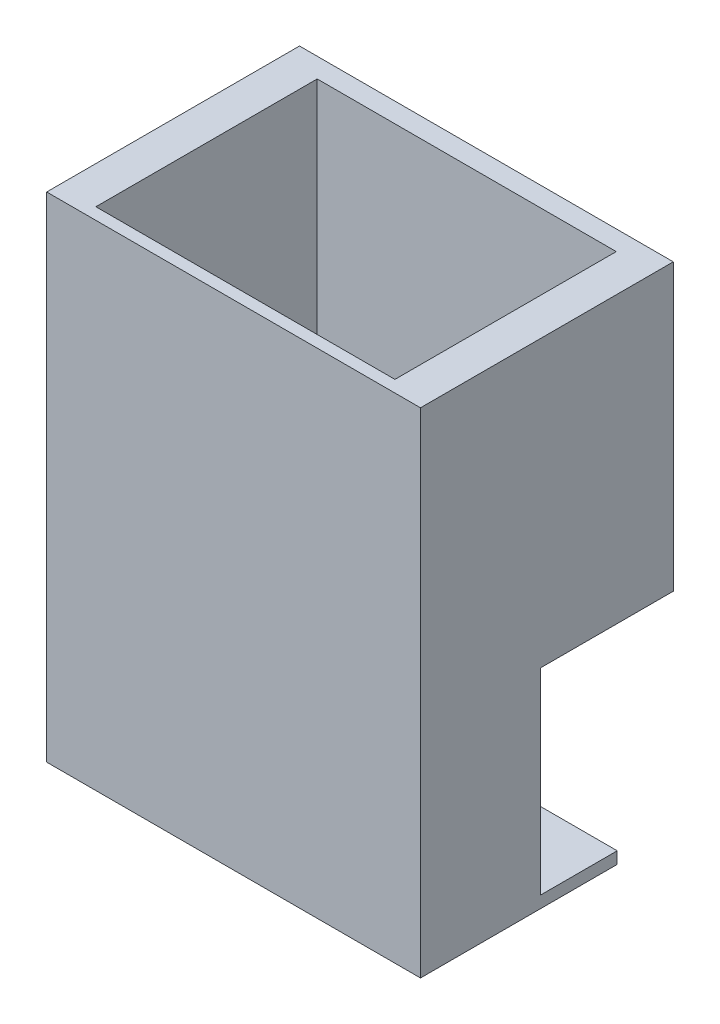
ISO-10303-21;
HEADER;
FILE_DESCRIPTION(('STEP AP214'),'2;1');
FILE_NAME('part.step','',(''),(''),'','','');
FILE_SCHEMA(('AUTOMOTIVE_DESIGN { 1 0 10303 214 1 1 1 1 }'));
ENDSEC;
DATA;
#1=APPLICATION_CONTEXT('core data for automotive mechanical design processes');
#2=APPLICATION_PROTOCOL_DEFINITION('international standard','automotive_design',2000,#1);
#3=PRODUCT_CONTEXT('',#1,'mechanical');
#4=PRODUCT('Part','Part','',(#3));
#5=PRODUCT_RELATED_PRODUCT_CATEGORY('part','',(#4));
#6=PRODUCT_DEFINITION_FORMATION('','',#4);
#7=PRODUCT_DEFINITION_CONTEXT('part definition',#1,'design');
#8=PRODUCT_DEFINITION('design','',#6,#7);
#9=PRODUCT_DEFINITION_SHAPE('','',#8);
#10=(LENGTH_UNIT() NAMED_UNIT(*) SI_UNIT(.MILLI.,.METRE.));
#11=(NAMED_UNIT(*) PLANE_ANGLE_UNIT() SI_UNIT($,.RADIAN.));
#12=(NAMED_UNIT(*) SI_UNIT($,.STERADIAN.) SOLID_ANGLE_UNIT());
#13=UNCERTAINTY_MEASURE_WITH_UNIT(LENGTH_MEASURE(1.E-05),#10,'distance_accuracy_value','');
#14=(GEOMETRIC_REPRESENTATION_CONTEXT(3) GLOBAL_UNCERTAINTY_ASSIGNED_CONTEXT((#13)) GLOBAL_UNIT_ASSIGNED_CONTEXT((#10,
#11,#12)) REPRESENTATION_CONTEXT('',''));
#15=CARTESIAN_POINT('',(0.,0.,0.));
#16=DIRECTION('',(0.,0.,1.));
#17=DIRECTION('',(1.,0.,0.));
#18=AXIS2_PLACEMENT_3D('',#15,#16,#17);
#19=CARTESIAN_POINT('',(0.,38.354,0.));
#20=DIRECTION('',(0.,-1.,0.));
#21=DIRECTION('',(0.,0.,-1.));
#22=AXIS2_PLACEMENT_3D('',#19,#20,#21);
#23=PLANE('',#22);
#24=DIRECTION('',(-1.,0.,0.));
#25=VECTOR('',#24,1.);
#26=CARTESIAN_POINT('',(43.434,38.354,-12.319));
#27=LINE('',#26,#25);
#28=CARTESIAN_POINT('',(43.434,38.354,-12.319));
#29=VERTEX_POINT('',#28);
#30=CARTESIAN_POINT('',(40.259,38.354,-12.319));
#31=VERTEX_POINT('',#30);
#32=EDGE_CURVE('E305',#29,#31,#27,.T.);
#33=ORIENTED_EDGE('',*,*,#32,.F.);
#34=DIRECTION('',(0.,0.,-1.));
#35=VECTOR('',#34,1.);
#36=CARTESIAN_POINT('',(43.434,38.354,-1.52399999999999));
#37=LINE('',#36,#35);
#38=CARTESIAN_POINT('',(43.434,38.354,-15.494));
#39=VERTEX_POINT('',#38);
#40=EDGE_CURVE('E11',#29,#39,#37,.T.);
#41=ORIENTED_EDGE('',*,*,#40,.T.);
#42=DIRECTION('',(-1.,0.,0.));
#43=VECTOR('',#42,1.);
#44=CARTESIAN_POINT('',(43.434,38.354,-15.494));
#45=LINE('',#44,#43);
#46=CARTESIAN_POINT('',(40.259,38.354,-15.494));
#47=VERTEX_POINT('',#46);
#48=EDGE_CURVE('E333',#39,#47,#45,.T.);
#49=ORIENTED_EDGE('',*,*,#48,.T.);
#50=DIRECTION('',(0.,0.,-1.));
#51=VECTOR('',#50,1.);
#52=CARTESIAN_POINT('',(40.259,38.354,-15.494));
#53=LINE('',#52,#51);
#54=EDGE_CURVE('E297',#31,#47,#53,.T.);
#55=ORIENTED_EDGE('',*,*,#54,.F.);
#56=EDGE_LOOP('',(#33,#41,#49,#55));
#57=FACE_BOUND('',#56,.T.);
#58=ADVANCED_FACE('F43',(#57),#23,.F.);
#59=CARTESIAN_POINT('',(0.,38.354,-15.494));
#60=DIRECTION('',(0.,0.,1.));
#61=DIRECTION('',(1.,0.,0.));
#62=AXIS2_PLACEMENT_3D('',#59,#60,#61);
#63=PLANE('',#62);
#64=DIRECTION('',(0.,-1.,0.));
#65=VECTOR('',#64,1.);
#66=CARTESIAN_POINT('',(4.826,38.354,-15.494));
#67=LINE('',#66,#65);
#68=CARTESIAN_POINT('',(4.826,38.354,-15.494));
#69=VERTEX_POINT('',#68);
#70=CARTESIAN_POINT('',(4.826,26.924,-15.494));
#71=VERTEX_POINT('',#70);
#72=EDGE_CURVE('E266',#69,#71,#67,.T.);
#73=ORIENTED_EDGE('',*,*,#72,.F.);
#74=DIRECTION('',(-1.,0.,0.));
#75=VECTOR('',#74,1.);
#76=CARTESIAN_POINT('',(0.,38.354,-15.494));
#77=LINE('',#76,#75);
#78=CARTESIAN_POINT('',(8.001,38.354,-15.494));
#79=VERTEX_POINT('',#78);
#80=EDGE_CURVE('E336',#79,#69,#77,.T.);
#81=ORIENTED_EDGE('',*,*,#80,.F.);
#82=DIRECTION('',(0.109679122404642,-0.993967046792069,0.));
#83=VECTOR('',#82,1.);
#84=CARTESIAN_POINT('',(8.001,38.354,-15.494));
#85=LINE('',#84,#83);
#86=CARTESIAN_POINT('',(12.065,1.524,-15.494));
#87=VERTEX_POINT('',#86);
#88=EDGE_CURVE('E288',#79,#87,#85,.T.);
#89=ORIENTED_EDGE('',*,*,#88,.T.);
#90=DIRECTION('',(-1.,0.,0.));
#91=VECTOR('',#90,1.);
#92=CARTESIAN_POINT('',(0.,1.524,-15.494));
#93=LINE('',#92,#91);
#94=CARTESIAN_POINT('',(0.,1.524,-15.494));
#95=VERTEX_POINT('',#94);
#96=EDGE_CURVE('E67',#87,#95,#93,.T.);
#97=ORIENTED_EDGE('',*,*,#96,.T.);
#98=DIRECTION('',(0.,-1.,0.));
#99=VECTOR('',#98,1.);
#100=CARTESIAN_POINT('',(0.,38.354,-15.494));
#101=LINE('',#100,#99);
#102=CARTESIAN_POINT('',(0.,26.924,-15.494));
#103=VERTEX_POINT('',#102);
#104=EDGE_CURVE('E340',#103,#95,#101,.T.);
#105=ORIENTED_EDGE('',*,*,#104,.F.);
#106=DIRECTION('',(-1.,0.,0.));
#107=VECTOR('',#106,1.);
#108=CARTESIAN_POINT('',(0.,26.924,-15.494));
#109=LINE('',#108,#107);
#110=EDGE_CURVE('E263',#71,#103,#109,.T.);
#111=ORIENTED_EDGE('',*,*,#110,.F.);
#112=EDGE_LOOP('',(#73,#81,#89,#97,#105,#111));
#113=FACE_BOUND('',#112,.T.);
#114=ADVANCED_FACE('F430',(#113),#63,.F.);
#115=CARTESIAN_POINT('',(43.434,38.354,-15.494));
#116=DIRECTION('',(0.,0.,1.));
#117=DIRECTION('',(1.,0.,0.));
#118=AXIS2_PLACEMENT_3D('',#115,#116,#117);
#119=PLANE('',#118);
#120=DIRECTION('',(-1.,0.,0.));
#121=VECTOR('',#120,1.);
#122=CARTESIAN_POINT('',(48.26,26.924,-15.494));
#123=LINE('',#122,#121);
#124=CARTESIAN_POINT('',(48.26,26.924,-15.494));
#125=VERTEX_POINT('',#124);
#126=CARTESIAN_POINT('',(43.434,26.924,-15.494));
#127=VERTEX_POINT('',#126);
#128=EDGE_CURVE('E269',#125,#127,#123,.T.);
#129=ORIENTED_EDGE('',*,*,#128,.F.);
#130=DIRECTION('',(0.,-1.,0.));
#131=VECTOR('',#130,1.);
#132=CARTESIAN_POINT('',(48.26,38.354,-15.494));
#133=LINE('',#132,#131);
#134=CARTESIAN_POINT('',(48.26,1.524,-15.494));
#135=VERTEX_POINT('',#134);
#136=EDGE_CURVE('E364',#125,#135,#133,.T.);
#137=ORIENTED_EDGE('',*,*,#136,.T.);
#138=DIRECTION('',(-1.,0.,0.));
#139=VECTOR('',#138,1.);
#140=CARTESIAN_POINT('',(43.434,1.524,-15.494));
#141=LINE('',#140,#139);
#142=CARTESIAN_POINT('',(36.195,1.524,-15.494));
#143=VERTEX_POINT('',#142);
#144=EDGE_CURVE('E328',#135,#143,#141,.T.);
#145=ORIENTED_EDGE('',*,*,#144,.T.);
#146=DIRECTION('',(0.109679122404642,0.993967046792069,0.));
#147=VECTOR('',#146,1.);
#148=CARTESIAN_POINT('',(40.259,38.354,-15.494));
#149=LINE('',#148,#147);
#150=EDGE_CURVE('E292',#143,#47,#149,.T.);
#151=ORIENTED_EDGE('',*,*,#150,.T.);
#152=ORIENTED_EDGE('',*,*,#48,.F.);
#153=DIRECTION('',(0.,1.,0.));
#154=VECTOR('',#153,1.);
#155=CARTESIAN_POINT('',(43.434,38.354,-15.494));
#156=LINE('',#155,#154);
#157=EDGE_CURVE('E198',#127,#39,#156,.T.);
#158=ORIENTED_EDGE('',*,*,#157,.F.);
#159=EDGE_LOOP('',(#129,#137,#145,#151,#152,#158));
#160=FACE_BOUND('',#159,.T.);
#161=ADVANCED_FACE('F456',(#160),#119,.F.);
#162=CARTESIAN_POINT('',(0.,1.524,0.));
#163=DIRECTION('',(0.,-1.,0.));
#164=DIRECTION('',(0.,0.,-1.));
#165=AXIS2_PLACEMENT_3D('',#162,#163,#164);
#166=PLANE('',#165);
#167=ORIENTED_EDGE('',*,*,#96,.F.);
#168=DIRECTION('',(0.,0.,-1.));
#169=VECTOR('',#168,1.);
#170=CARTESIAN_POINT('',(12.065,1.524,24.7345422868044));
#171=LINE('',#170,#169);
#172=CARTESIAN_POINT('',(12.065,1.524,-12.319));
#173=VERTEX_POINT('',#172);
#174=EDGE_CURVE('E285',#173,#87,#171,.T.);
#175=ORIENTED_EDGE('',*,*,#174,.F.);
#176=DIRECTION('',(1.,0.,0.));
#177=VECTOR('',#176,1.);
#178=CARTESIAN_POINT('',(4.826,1.524,-12.319));
#179=LINE('',#178,#177);
#180=CARTESIAN_POINT('',(4.826,1.524,-12.319));
#181=VERTEX_POINT('',#180);
#182=EDGE_CURVE('E315',#181,#173,#179,.T.);
#183=ORIENTED_EDGE('',*,*,#182,.F.);
#184=DIRECTION('',(0.,0.,-1.));
#185=VECTOR('',#184,1.);
#186=CARTESIAN_POINT('',(4.826,1.524,-15.494));
#187=LINE('',#186,#185);
#188=CARTESIAN_POINT('',(4.826,1.524,-1.52399999999999));
#189=VERTEX_POINT('',#188);
#190=EDGE_CURVE('E350',#189,#181,#187,.T.);
#191=ORIENTED_EDGE('',*,*,#190,.F.);
#192=DIRECTION('',(-1.,0.,0.));
#193=VECTOR('',#192,1.);
#194=CARTESIAN_POINT('',(4.826,1.524,-1.52399999999999));
#195=LINE('',#194,#193);
#196=CARTESIAN_POINT('',(43.434,1.524,-1.52399999999999));
#197=VERTEX_POINT('',#196);
#198=EDGE_CURVE('E346',#197,#189,#195,.T.);
#199=ORIENTED_EDGE('',*,*,#198,.F.);
#200=DIRECTION('',(0.,0.,1.));
#201=VECTOR('',#200,1.);
#202=CARTESIAN_POINT('',(43.434,1.524,-1.52399999999999));
#203=LINE('',#202,#201);
#204=CARTESIAN_POINT('',(43.434,1.524,-12.319));
#205=VERTEX_POINT('',#204);
#206=EDGE_CURVE('E343',#205,#197,#203,.T.);
#207=ORIENTED_EDGE('',*,*,#206,.F.);
#208=DIRECTION('',(1.,0.,0.));
#209=VECTOR('',#208,1.);
#210=CARTESIAN_POINT('',(43.434,1.524,-12.319));
#211=LINE('',#210,#209);
#212=CARTESIAN_POINT('',(36.195,1.524,-12.319));
#213=VERTEX_POINT('',#212);
#214=EDGE_CURVE('E312',#213,#205,#211,.T.);
#215=ORIENTED_EDGE('',*,*,#214,.F.);
#216=DIRECTION('',(0.,0.,-1.));
#217=VECTOR('',#216,1.);
#218=CARTESIAN_POINT('',(36.195,1.524,24.7345422868044));
#219=LINE('',#218,#217);
#220=EDGE_CURVE('E298',#213,#143,#219,.T.);
#221=ORIENTED_EDGE('',*,*,#220,.T.);
#222=ORIENTED_EDGE('',*,*,#144,.F.);
#223=DIRECTION('',(0.,0.,-1.));
#224=VECTOR('',#223,1.);
#225=CARTESIAN_POINT('',(48.26,1.524,0.));
#226=LINE('',#225,#224);
#227=CARTESIAN_POINT('',(48.26,1.524,-25.4));
#228=VERTEX_POINT('',#227);
#229=EDGE_CURVE('E376',#135,#228,#226,.T.);
#230=ORIENTED_EDGE('',*,*,#229,.T.);
#231=DIRECTION('',(1.,0.,0.));
#232=VECTOR('',#231,1.);
#233=CARTESIAN_POINT('',(0.,1.524,-25.4));
#234=LINE('',#233,#232);
#235=CARTESIAN_POINT('',(0.,1.524,-25.4));
#236=VERTEX_POINT('',#235);
#237=EDGE_CURVE('E371',#236,#228,#234,.T.);
#238=ORIENTED_EDGE('',*,*,#237,.F.);
#239=DIRECTION('',(0.,0.,-1.));
#240=VECTOR('',#239,1.);
#241=CARTESIAN_POINT('',(0.,1.524,0.));
#242=LINE('',#241,#240);
#243=EDGE_CURVE('E368',#95,#236,#242,.T.);
#244=ORIENTED_EDGE('',*,*,#243,.F.);
#245=EDGE_LOOP('',(#167,#175,#183,#191,#199,#207,#215,#221,#222,#230,#238,#244));
#246=FACE_BOUND('',#245,.T.);
#247=ADVANCED_FACE('F437',(#246),#166,.F.);
#248=CARTESIAN_POINT('',(43.434,38.354,-1.52399999999999));
#249=DIRECTION('',(1.,0.,0.));
#250=DIRECTION('',(0.,0.,-1.));
#251=AXIS2_PLACEMENT_3D('',#248,#249,#250);
#252=PLANE('',#251);
#253=DIRECTION('',(0.,-1.,0.));
#254=VECTOR('',#253,1.);
#255=CARTESIAN_POINT('',(43.434,42.8441280605346,-12.319));
#256=LINE('',#255,#254);
#257=EDGE_CURVE('E309',#29,#205,#256,.T.);
#258=ORIENTED_EDGE('',*,*,#257,.T.);
#259=ORIENTED_EDGE('',*,*,#206,.T.);
#260=DIRECTION('',(0.,-1.,0.));
#261=VECTOR('',#260,1.);
#262=CARTESIAN_POINT('',(43.434,38.354,-1.52399999999999));
#263=LINE('',#262,#261);
#264=CARTESIAN_POINT('',(43.434,63.754,-1.52399999999999));
#265=VERTEX_POINT('',#264);
#266=EDGE_CURVE('E205',#265,#197,#263,.T.);
#267=ORIENTED_EDGE('',*,*,#266,.F.);
#268=DIRECTION('',(0.,0.,-1.));
#269=VECTOR('',#268,1.);
#270=CARTESIAN_POINT('',(43.434,63.754,-1.52399999999999));
#271=LINE('',#270,#269);
#272=CARTESIAN_POINT('',(43.434,63.754,-30.099));
#273=VERTEX_POINT('',#272);
#274=EDGE_CURVE('E201',#265,#273,#271,.T.);
#275=ORIENTED_EDGE('',*,*,#274,.T.);
#276=DIRECTION('',(0.,1.,0.));
#277=VECTOR('',#276,1.);
#278=CARTESIAN_POINT('',(43.434,38.354,-30.099));
#279=LINE('',#278,#277);
#280=CARTESIAN_POINT('',(43.434,26.924,-30.099));
#281=VERTEX_POINT('',#280);
#282=EDGE_CURVE('E185',#281,#273,#279,.T.);
#283=ORIENTED_EDGE('',*,*,#282,.F.);
#284=DIRECTION('',(0.,0.,1.));
#285=VECTOR('',#284,1.);
#286=CARTESIAN_POINT('',(43.434,26.924,-30.099));
#287=LINE('',#286,#285);
#288=EDGE_CURVE('E197',#281,#127,#287,.T.);
#289=ORIENTED_EDGE('',*,*,#288,.T.);
#290=ORIENTED_EDGE('',*,*,#157,.T.);
#291=ORIENTED_EDGE('',*,*,#40,.F.);
#292=EDGE_LOOP('',(#258,#259,#267,#275,#283,#289,#290,#291));
#293=FACE_BOUND('',#292,.T.);
#294=ADVANCED_FACE('F203',(#293),#252,.F.);
#295=CARTESIAN_POINT('',(4.826,38.354,-15.494));
#296=DIRECTION('',(-1.,0.,0.));
#297=DIRECTION('',(0.,0.,1.));
#298=AXIS2_PLACEMENT_3D('',#295,#296,#297);
#299=PLANE('',#298);
#300=DIRECTION('',(0.,-1.,0.));
#301=VECTOR('',#300,1.);
#302=CARTESIAN_POINT('',(4.826,42.8441280605346,-12.319));
#303=LINE('',#302,#301);
#304=CARTESIAN_POINT('',(4.826,38.354,-12.319));
#305=VERTEX_POINT('',#304);
#306=EDGE_CURVE('E324',#305,#181,#303,.T.);
#307=ORIENTED_EDGE('',*,*,#306,.F.);
#308=DIRECTION('',(0.,0.,1.));
#309=VECTOR('',#308,1.);
#310=CARTESIAN_POINT('',(4.826,38.354,-1.52399999999999));
#311=LINE('',#310,#309);
#312=EDGE_CURVE('E53',#69,#305,#311,.T.);
#313=ORIENTED_EDGE('',*,*,#312,.F.);
#314=ORIENTED_EDGE('',*,*,#72,.T.);
#315=DIRECTION('',(0.,0.,1.));
#316=VECTOR('',#315,1.);
#317=CARTESIAN_POINT('',(4.826,26.924,-30.099));
#318=LINE('',#317,#316);
#319=CARTESIAN_POINT('',(4.826,26.924,-30.099));
#320=VERTEX_POINT('',#319);
#321=EDGE_CURVE('E254',#320,#71,#318,.T.);
#322=ORIENTED_EDGE('',*,*,#321,.F.);
#323=DIRECTION('',(0.,-1.,0.));
#324=VECTOR('',#323,1.);
#325=CARTESIAN_POINT('',(4.826,38.354,-30.099));
#326=LINE('',#325,#324);
#327=CARTESIAN_POINT('',(4.826,63.754,-30.099));
#328=VERTEX_POINT('',#327);
#329=EDGE_CURVE('E262',#328,#320,#326,.T.);
#330=ORIENTED_EDGE('',*,*,#329,.F.);
#331=DIRECTION('',(0.,0.,1.));
#332=VECTOR('',#331,1.);
#333=CARTESIAN_POINT('',(4.826,63.754,-1.52399999999999));
#334=LINE('',#333,#332);
#335=CARTESIAN_POINT('',(4.826,63.754,-1.52399999999999));
#336=VERTEX_POINT('',#335);
#337=EDGE_CURVE('E213',#328,#336,#334,.T.);
#338=ORIENTED_EDGE('',*,*,#337,.T.);
#339=DIRECTION('',(0.,-1.,0.));
#340=VECTOR('',#339,1.);
#341=CARTESIAN_POINT('',(4.826,38.354,-1.52399999999999));
#342=LINE('',#341,#340);
#343=EDGE_CURVE('E358',#336,#189,#342,.T.);
#344=ORIENTED_EDGE('',*,*,#343,.T.);
#345=ORIENTED_EDGE('',*,*,#190,.T.);
#346=EDGE_LOOP('',(#307,#313,#314,#322,#330,#338,#344,#345));
#347=FACE_BOUND('',#346,.T.);
#348=ADVANCED_FACE('F441',(#347),#299,.F.);
#349=CARTESIAN_POINT('',(0.,1.524,0.));
#350=DIRECTION('',(-1.,0.,0.));
#351=DIRECTION('',(0.,0.,1.));
#352=AXIS2_PLACEMENT_3D('',#349,#350,#351);
#353=PLANE('',#352);
#354=DIRECTION('',(0.,0.,-1.));
#355=VECTOR('',#354,1.);
#356=CARTESIAN_POINT('',(0.,0.,0.));
#357=LINE('',#356,#355);
#358=CARTESIAN_POINT('',(0.,0.,0.));
#359=VERTEX_POINT('',#358);
#360=CARTESIAN_POINT('',(0.,0.,-25.4));
#361=VERTEX_POINT('',#360);
#362=EDGE_CURVE('E367',#359,#361,#357,.T.);
#363=ORIENTED_EDGE('',*,*,#362,.F.);
#364=DIRECTION('',(0.,-1.,0.));
#365=VECTOR('',#364,1.);
#366=CARTESIAN_POINT('',(0.,1.524,0.));
#367=LINE('',#366,#365);
#368=CARTESIAN_POINT('',(0.,63.754,0.));
#369=VERTEX_POINT('',#368);
#370=EDGE_CURVE('E226',#369,#359,#367,.T.);
#371=ORIENTED_EDGE('',*,*,#370,.F.);
#372=DIRECTION('',(0.,0.,1.));
#373=VECTOR('',#372,1.);
#374=CARTESIAN_POINT('',(0.,63.754,-32.639));
#375=LINE('',#374,#373);
#376=CARTESIAN_POINT('',(0.,63.754,-32.639));
#377=VERTEX_POINT('',#376);
#378=EDGE_CURVE('E221',#377,#369,#375,.T.);
#379=ORIENTED_EDGE('',*,*,#378,.F.);
#380=DIRECTION('',(0.,1.,0.));
#381=VECTOR('',#380,1.);
#382=CARTESIAN_POINT('',(0.,38.354,-32.639));
#383=LINE('',#382,#381);
#384=CARTESIAN_POINT('',(0.,26.924,-32.639));
#385=VERTEX_POINT('',#384);
#386=EDGE_CURVE('E246',#385,#377,#383,.T.);
#387=ORIENTED_EDGE('',*,*,#386,.F.);
#388=DIRECTION('',(0.,0.,1.));
#389=VECTOR('',#388,1.);
#390=CARTESIAN_POINT('',(0.,26.924,-30.099));
#391=LINE('',#390,#389);
#392=EDGE_CURVE('E258',#385,#103,#391,.T.);
#393=ORIENTED_EDGE('',*,*,#392,.T.);
#394=ORIENTED_EDGE('',*,*,#104,.T.);
#395=ORIENTED_EDGE('',*,*,#243,.T.);
#396=DIRECTION('',(0.,-1.,0.));
#397=VECTOR('',#396,1.);
#398=CARTESIAN_POINT('',(0.,1.524,-25.4));
#399=LINE('',#398,#397);
#400=EDGE_CURVE('E47',#236,#361,#399,.T.);
#401=ORIENTED_EDGE('',*,*,#400,.T.);
#402=EDGE_LOOP('',(#363,#371,#379,#387,#393,#394,#395,#401));
#403=FACE_BOUND('',#402,.T.);
#404=ADVANCED_FACE('F45',(#403),#353,.T.);
#405=CARTESIAN_POINT('',(0.,1.524,0.));
#406=DIRECTION('',(0.,0.,-1.));
#407=DIRECTION('',(-1.,0.,0.));
#408=AXIS2_PLACEMENT_3D('',#405,#406,#407);
#409=PLANE('',#408);
#410=DIRECTION('',(1.,0.,0.));
#411=VECTOR('',#410,1.);
#412=CARTESIAN_POINT('',(0.,0.,0.));
#413=LINE('',#412,#411);
#414=CARTESIAN_POINT('',(48.26,0.,0.));
#415=VERTEX_POINT('',#414);
#416=EDGE_CURVE('E372',#359,#415,#413,.T.);
#417=ORIENTED_EDGE('',*,*,#416,.T.);
#418=DIRECTION('',(0.,-1.,0.));
#419=VECTOR('',#418,1.);
#420=CARTESIAN_POINT('',(48.26,1.524,0.));
#421=LINE('',#420,#419);
#422=CARTESIAN_POINT('',(48.26,63.754,0.));
#423=VERTEX_POINT('',#422);
#424=EDGE_CURVE('E394',#423,#415,#421,.T.);
#425=ORIENTED_EDGE('',*,*,#424,.F.);
#426=DIRECTION('',(1.,0.,0.));
#427=VECTOR('',#426,1.);
#428=CARTESIAN_POINT('',(0.,63.754,0.));
#429=LINE('',#428,#427);
#430=EDGE_CURVE('E230',#369,#423,#429,.T.);
#431=ORIENTED_EDGE('',*,*,#430,.F.);
#432=ORIENTED_EDGE('',*,*,#370,.T.);
#433=EDGE_LOOP('',(#417,#425,#431,#432));
#434=FACE_BOUND('',#433,.T.);
#435=ADVANCED_FACE('F413',(#434),#409,.F.);
#436=CARTESIAN_POINT('',(48.26,1.524,0.));
#437=DIRECTION('',(-1.,0.,0.));
#438=DIRECTION('',(0.,0.,1.));
#439=AXIS2_PLACEMENT_3D('',#436,#437,#438);
#440=PLANE('',#439);
#441=DIRECTION('',(0.,0.,-1.));
#442=VECTOR('',#441,1.);
#443=CARTESIAN_POINT('',(48.26,0.,0.));
#444=LINE('',#443,#442);
#445=CARTESIAN_POINT('',(48.26,0.,-25.4));
#446=VERTEX_POINT('',#445);
#447=EDGE_CURVE('E386',#415,#446,#444,.T.);
#448=ORIENTED_EDGE('',*,*,#447,.T.);
#449=DIRECTION('',(0.,-1.,0.));
#450=VECTOR('',#449,1.);
#451=CARTESIAN_POINT('',(48.26,1.524,-25.4));
#452=LINE('',#451,#450);
#453=EDGE_CURVE('E397',#228,#446,#452,.T.);
#454=ORIENTED_EDGE('',*,*,#453,.F.);
#455=ORIENTED_EDGE('',*,*,#229,.F.);
#456=ORIENTED_EDGE('',*,*,#136,.F.);
#457=DIRECTION('',(0.,0.,1.));
#458=VECTOR('',#457,1.);
#459=CARTESIAN_POINT('',(48.26,26.924,-30.099));
#460=LINE('',#459,#458);
#461=CARTESIAN_POINT('',(48.26,26.924,-32.639));
#462=VERTEX_POINT('',#461);
#463=EDGE_CURVE('E278',#462,#125,#460,.T.);
#464=ORIENTED_EDGE('',*,*,#463,.F.);
#465=DIRECTION('',(0.,1.,0.));
#466=VECTOR('',#465,1.);
#467=CARTESIAN_POINT('',(48.26,38.354,-32.639));
#468=LINE('',#467,#466);
#469=CARTESIAN_POINT('',(48.26,63.754,-32.639));
#470=VERTEX_POINT('',#469);
#471=EDGE_CURVE('E242',#462,#470,#468,.T.);
#472=ORIENTED_EDGE('',*,*,#471,.T.);
#473=DIRECTION('',(0.,0.,-1.));
#474=VECTOR('',#473,1.);
#475=CARTESIAN_POINT('',(48.26,63.754,-32.639));
#476=LINE('',#475,#474);
#477=EDGE_CURVE('E234',#423,#470,#476,.T.);
#478=ORIENTED_EDGE('',*,*,#477,.F.);
#479=ORIENTED_EDGE('',*,*,#424,.T.);
#480=EDGE_LOOP('',(#448,#454,#455,#456,#464,#472,#478,#479));
#481=FACE_BOUND('',#480,.T.);
#482=ADVANCED_FACE('F417',(#481),#440,.F.);
#483=CARTESIAN_POINT('',(0.,1.524,-25.4));
#484=DIRECTION('',(0.,0.,-1.));
#485=DIRECTION('',(-1.,0.,0.));
#486=AXIS2_PLACEMENT_3D('',#483,#484,#485);
#487=PLANE('',#486);
#488=DIRECTION('',(1.,0.,0.));
#489=VECTOR('',#488,1.);
#490=CARTESIAN_POINT('',(0.,0.,-25.4));
#491=LINE('',#490,#489);
#492=EDGE_CURVE('E382',#361,#446,#491,.T.);
#493=ORIENTED_EDGE('',*,*,#492,.F.);
#494=ORIENTED_EDGE('',*,*,#400,.F.);
#495=ORIENTED_EDGE('',*,*,#237,.T.);
#496=ORIENTED_EDGE('',*,*,#453,.T.);
#497=EDGE_LOOP('',(#493,#494,#495,#496));
#498=FACE_BOUND('',#497,.T.);
#499=ADVANCED_FACE('F407',(#498),#487,.T.);
#500=CARTESIAN_POINT('',(0.,0.,0.));
#501=DIRECTION('',(0.,-1.,0.));
#502=DIRECTION('',(0.,0.,-1.));
#503=AXIS2_PLACEMENT_3D('',#500,#501,#502);
#504=PLANE('',#503);
#505=ORIENTED_EDGE('',*,*,#362,.T.);
#506=ORIENTED_EDGE('',*,*,#492,.T.);
#507=ORIENTED_EDGE('',*,*,#447,.F.);
#508=ORIENTED_EDGE('',*,*,#416,.F.);
#509=EDGE_LOOP('',(#505,#506,#507,#508));
#510=FACE_BOUND('',#509,.T.);
#511=ADVANCED_FACE('F411',(#510),#504,.T.);
#512=CARTESIAN_POINT('',(4.826,38.354,-1.52399999999999));
#513=DIRECTION('',(0.,0.,1.));
#514=DIRECTION('',(1.,0.,0.));
#515=AXIS2_PLACEMENT_3D('',#512,#513,#514);
#516=PLANE('',#515);
#517=ORIENTED_EDGE('',*,*,#198,.T.);
#518=ORIENTED_EDGE('',*,*,#343,.F.);
#519=DIRECTION('',(1.,0.,0.));
#520=VECTOR('',#519,1.);
#521=CARTESIAN_POINT('',(43.434,63.754,-1.52399999999999));
#522=LINE('',#521,#520);
#523=EDGE_CURVE('E217',#336,#265,#522,.T.);
#524=ORIENTED_EDGE('',*,*,#523,.T.);
#525=ORIENTED_EDGE('',*,*,#266,.T.);
#526=EDGE_LOOP('',(#517,#518,#524,#525));
#527=FACE_BOUND('',#526,.T.);
#528=ADVANCED_FACE('F444',(#527),#516,.F.);
#529=ORIENTED_EDGE('',*,*,#80,.T.);
#530=ORIENTED_EDGE('',*,*,#312,.T.);
#531=DIRECTION('',(-1.,0.,0.));
#532=VECTOR('',#531,1.);
#533=CARTESIAN_POINT('',(4.826,38.354,-12.319));
#534=LINE('',#533,#532);
#535=CARTESIAN_POINT('',(8.001,38.354,-12.319));
#536=VERTEX_POINT('',#535);
#537=EDGE_CURVE('E323',#536,#305,#534,.T.);
#538=ORIENTED_EDGE('',*,*,#537,.F.);
#539=DIRECTION('',(0.,0.,1.));
#540=VECTOR('',#539,1.);
#541=CARTESIAN_POINT('',(8.001,38.354,-15.494));
#542=LINE('',#541,#540);
#543=EDGE_CURVE('E319',#79,#536,#542,.T.);
#544=ORIENTED_EDGE('',*,*,#543,.F.);
#545=EDGE_LOOP('',(#529,#530,#538,#544));
#546=FACE_BOUND('',#545,.T.);
#547=ADVANCED_FACE('F475',(#546),#23,.F.);
#548=CARTESIAN_POINT('',(4.826,42.8441280605346,-12.319));
#549=DIRECTION('',(0.,0.,-1.));
#550=DIRECTION('',(-1.,0.,0.));
#551=AXIS2_PLACEMENT_3D('',#548,#549,#550);
#552=PLANE('',#551);
#553=ORIENTED_EDGE('',*,*,#182,.T.);
#554=DIRECTION('',(-0.109679122404642,0.993967046792069,0.));
#555=VECTOR('',#554,1.);
#556=CARTESIAN_POINT('',(8.001,38.354,-12.319));
#557=LINE('',#556,#555);
#558=EDGE_CURVE('E281',#173,#536,#557,.T.);
#559=ORIENTED_EDGE('',*,*,#558,.T.);
#560=ORIENTED_EDGE('',*,*,#537,.T.);
#561=ORIENTED_EDGE('',*,*,#306,.T.);
#562=EDGE_LOOP('',(#553,#559,#560,#561));
#563=FACE_BOUND('',#562,.T.);
#564=ADVANCED_FACE('F482',(#563),#552,.F.);
#565=CARTESIAN_POINT('',(43.434,42.8441280605346,-12.319));
#566=DIRECTION('',(0.,0.,-1.));
#567=DIRECTION('',(-1.,0.,0.));
#568=AXIS2_PLACEMENT_3D('',#565,#566,#567);
#569=PLANE('',#568);
#570=ORIENTED_EDGE('',*,*,#257,.F.);
#571=ORIENTED_EDGE('',*,*,#32,.T.);
#572=DIRECTION('',(-0.109679122404642,-0.993967046792069,0.));
#573=VECTOR('',#572,1.);
#574=CARTESIAN_POINT('',(40.259,38.354,-12.319));
#575=LINE('',#574,#573);
#576=EDGE_CURVE('E293',#31,#213,#575,.T.);
#577=ORIENTED_EDGE('',*,*,#576,.T.);
#578=ORIENTED_EDGE('',*,*,#214,.T.);
#579=EDGE_LOOP('',(#570,#571,#577,#578));
#580=FACE_BOUND('',#579,.T.);
#581=ADVANCED_FACE('F447',(#580),#569,.F.);
#582=CARTESIAN_POINT('',(40.259,38.354,24.7345422868044));
#583=DIRECTION('',(-0.993967046792069,0.109679122404642,0.));
#584=DIRECTION('',(-0.109679122404642,-0.993967046792069,0.));
#585=AXIS2_PLACEMENT_3D('',#582,#583,#584);
#586=PLANE('',#585);
#587=ORIENTED_EDGE('',*,*,#576,.F.);
#588=ORIENTED_EDGE('',*,*,#54,.T.);
#589=ORIENTED_EDGE('',*,*,#150,.F.);
#590=ORIENTED_EDGE('',*,*,#220,.F.);
#591=EDGE_LOOP('',(#587,#588,#589,#590));
#592=FACE_BOUND('',#591,.T.);
#593=ADVANCED_FACE('F452',(#592),#586,.T.);
#594=CARTESIAN_POINT('',(8.001,38.354,24.7345422868044));
#595=DIRECTION('',(0.993967046792069,0.109679122404642,0.));
#596=DIRECTION('',(-0.109679122404642,0.993967046792069,0.));
#597=AXIS2_PLACEMENT_3D('',#594,#595,#596);
#598=PLANE('',#597);
#599=ORIENTED_EDGE('',*,*,#558,.F.);
#600=ORIENTED_EDGE('',*,*,#174,.T.);
#601=ORIENTED_EDGE('',*,*,#88,.F.);
#602=ORIENTED_EDGE('',*,*,#543,.T.);
#603=EDGE_LOOP('',(#599,#600,#601,#602));
#604=FACE_BOUND('',#603,.T.);
#605=ADVANCED_FACE('F435',(#604),#598,.T.);
#606=CARTESIAN_POINT('',(48.26,26.924,-30.099));
#607=DIRECTION('',(0.,1.,0.));
#608=DIRECTION('',(-1.,0.,0.));
#609=AXIS2_PLACEMENT_3D('',#606,#607,#608);
#610=PLANE('',#609);
#611=ORIENTED_EDGE('',*,*,#128,.T.);
#612=ORIENTED_EDGE('',*,*,#288,.F.);
#613=DIRECTION('',(1.,0.,0.));
#614=VECTOR('',#613,1.);
#615=CARTESIAN_POINT('',(-11.7088214607619,26.924,-30.099));
#616=LINE('',#615,#614);
#617=EDGE_CURVE('E193',#320,#281,#616,.T.);
#618=ORIENTED_EDGE('',*,*,#617,.F.);
#619=ORIENTED_EDGE('',*,*,#321,.T.);
#620=ORIENTED_EDGE('',*,*,#110,.T.);
#621=ORIENTED_EDGE('',*,*,#392,.F.);
#622=DIRECTION('',(1.,0.,0.));
#623=VECTOR('',#622,1.);
#624=CARTESIAN_POINT('',(-11.7088214607619,26.924,-32.639));
#625=LINE('',#624,#623);
#626=EDGE_CURVE('E245',#385,#462,#625,.T.);
#627=ORIENTED_EDGE('',*,*,#626,.T.);
#628=ORIENTED_EDGE('',*,*,#463,.T.);
#629=EDGE_LOOP('',(#611,#612,#618,#619,#620,#621,#627,#628));
#630=FACE_BOUND('',#629,.T.);
#631=ADVANCED_FACE('F461',(#630),#610,.F.);
#632=CARTESIAN_POINT('',(-11.7088214607619,38.354,-30.099));
#633=DIRECTION('',(0.,0.,1.));
#634=DIRECTION('',(1.,0.,0.));
#635=AXIS2_PLACEMENT_3D('',#632,#633,#634);
#636=PLANE('',#635);
#637=ORIENTED_EDGE('',*,*,#282,.T.);
#638=DIRECTION('',(-1.,0.,0.));
#639=VECTOR('',#638,1.);
#640=CARTESIAN_POINT('',(43.434,63.754,-30.099));
#641=LINE('',#640,#639);
#642=EDGE_CURVE('E190',#273,#328,#641,.T.);
#643=ORIENTED_EDGE('',*,*,#642,.T.);
#644=ORIENTED_EDGE('',*,*,#329,.T.);
#645=ORIENTED_EDGE('',*,*,#617,.T.);
#646=EDGE_LOOP('',(#637,#643,#644,#645));
#647=FACE_BOUND('',#646,.T.);
#648=ADVANCED_FACE('F187',(#647),#636,.T.);
#649=CARTESIAN_POINT('',(-11.7088214607619,38.354,-32.639));
#650=DIRECTION('',(0.,0.,-1.));
#651=DIRECTION('',(-1.,0.,0.));
#652=AXIS2_PLACEMENT_3D('',#649,#650,#651);
#653=PLANE('',#652);
#654=ORIENTED_EDGE('',*,*,#626,.F.);
#655=ORIENTED_EDGE('',*,*,#386,.T.);
#656=DIRECTION('',(-1.,0.,0.));
#657=VECTOR('',#656,1.);
#658=CARTESIAN_POINT('',(0.,63.754,-32.639));
#659=LINE('',#658,#657);
#660=EDGE_CURVE('E238',#470,#377,#659,.T.);
#661=ORIENTED_EDGE('',*,*,#660,.F.);
#662=ORIENTED_EDGE('',*,*,#471,.F.);
#663=EDGE_LOOP('',(#654,#655,#661,#662));
#664=FACE_BOUND('',#663,.T.);
#665=ADVANCED_FACE('F424',(#664),#653,.T.);
#666=CARTESIAN_POINT('',(0.,63.754,0.));
#667=DIRECTION('',(0.,1.,0.));
#668=DIRECTION('',(0.,0.,1.));
#669=AXIS2_PLACEMENT_3D('',#666,#667,#668);
#670=PLANE('',#669);
#671=ORIENTED_EDGE('',*,*,#378,.T.);
#672=ORIENTED_EDGE('',*,*,#430,.T.);
#673=ORIENTED_EDGE('',*,*,#477,.T.);
#674=ORIENTED_EDGE('',*,*,#660,.T.);
#675=EDGE_LOOP('',(#671,#672,#673,#674));
#676=FACE_BOUND('',#675,.T.);
#677=ORIENTED_EDGE('',*,*,#642,.F.);
#678=ORIENTED_EDGE('',*,*,#274,.F.);
#679=ORIENTED_EDGE('',*,*,#523,.F.);
#680=ORIENTED_EDGE('',*,*,#337,.F.);
#681=EDGE_LOOP('',(#677,#678,#679,#680));
#682=FACE_BOUND('',#681,.T.);
#683=ADVANCED_FACE('F211',(#676,#682),#670,.T.);
#684=CLOSED_SHELL('',(#58,#114,#161,#247,#294,#348,#404,#435,#482,#499,#511,#528,#547,#564,#581,
#593,#605,#631,#648,#665,#683));
#685=MANIFOLD_SOLID_BREP('B2',#684);
#686=ADVANCED_BREP_SHAPE_REPRESENTATION('',(#18,#685),#14);
#687=SHAPE_DEFINITION_REPRESENTATION(#9,#686);
ENDSEC;
END-ISO-10303-21;
